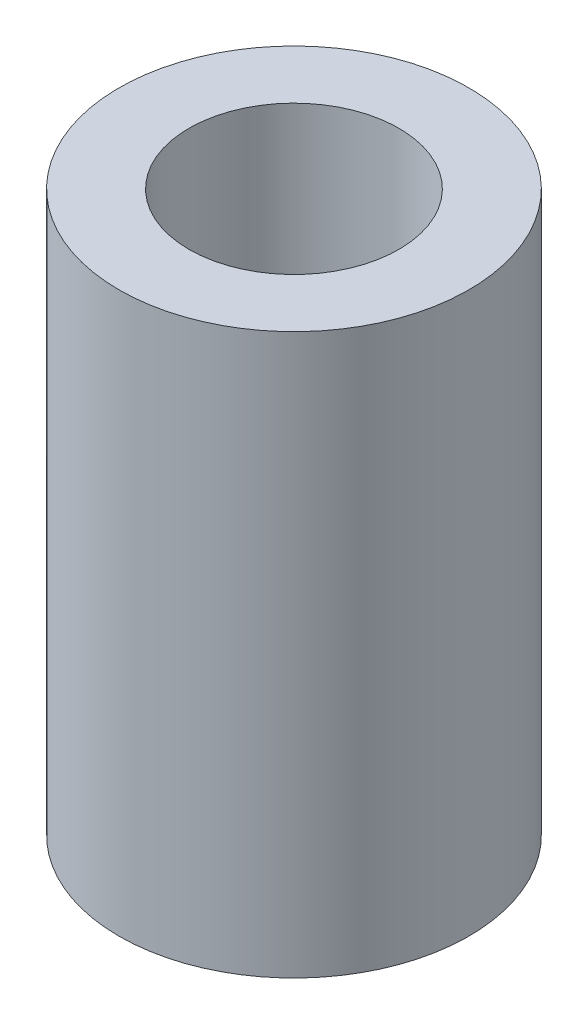
ISO-10303-21;
HEADER;
FILE_DESCRIPTION(('STEP AP214'),'2;1');
FILE_NAME('part.step','',(''),(''),'','','');
FILE_SCHEMA(('AUTOMOTIVE_DESIGN { 1 0 10303 214 1 1 1 1 }'));
ENDSEC;
DATA;
#1=APPLICATION_CONTEXT('core data for automotive mechanical design processes');
#2=APPLICATION_PROTOCOL_DEFINITION('international standard','automotive_design',2000,#1);
#3=PRODUCT_CONTEXT('',#1,'mechanical');
#4=PRODUCT('Part','Part','',(#3));
#5=PRODUCT_RELATED_PRODUCT_CATEGORY('part','',(#4));
#6=PRODUCT_DEFINITION_FORMATION('','',#4);
#7=PRODUCT_DEFINITION_CONTEXT('part definition',#1,'design');
#8=PRODUCT_DEFINITION('design','',#6,#7);
#9=PRODUCT_DEFINITION_SHAPE('','',#8);
#10=(LENGTH_UNIT() NAMED_UNIT(*) SI_UNIT(.MILLI.,.METRE.));
#11=(NAMED_UNIT(*) PLANE_ANGLE_UNIT() SI_UNIT($,.RADIAN.));
#12=(NAMED_UNIT(*) SI_UNIT($,.STERADIAN.) SOLID_ANGLE_UNIT());
#13=UNCERTAINTY_MEASURE_WITH_UNIT(LENGTH_MEASURE(1.E-05),#10,'distance_accuracy_value','');
#14=(GEOMETRIC_REPRESENTATION_CONTEXT(3) GLOBAL_UNCERTAINTY_ASSIGNED_CONTEXT((#13)) GLOBAL_UNIT_ASSIGNED_CONTEXT((#10,
#11,#12)) REPRESENTATION_CONTEXT('',''));
#15=CARTESIAN_POINT('',(0.,0.,0.));
#16=DIRECTION('',(0.,0.,1.));
#17=DIRECTION('',(1.,0.,0.));
#18=AXIS2_PLACEMENT_3D('',#15,#16,#17);
#19=CARTESIAN_POINT('',(0.,4.,0.));
#20=DIRECTION('',(0.,1.,0.));
#21=DIRECTION('',(0.,0.,1.));
#22=AXIS2_PLACEMENT_3D('',#19,#20,#21);
#23=PLANE('',#22);
#24=CARTESIAN_POINT('',(0.,4.,0.));
#25=DIRECTION('',(0.,1.,0.));
#26=DIRECTION('',(0.,0.,1.));
#27=AXIS2_PLACEMENT_3D('',#24,#25,#26);
#28=CIRCLE('',#27,2.5);
#29=CARTESIAN_POINT('',(0.,4.,2.5));
#30=VERTEX_POINT('',#29);
#31=EDGE_CURVE('E10',#30,#30,#28,.T.);
#32=ORIENTED_EDGE('',*,*,#31,.T.);
#33=EDGE_LOOP('',(#32));
#34=FACE_BOUND('',#33,.T.);
#35=CARTESIAN_POINT('',(0.,4.,0.));
#36=DIRECTION('',(0.,1.,0.));
#37=DIRECTION('',(0.,0.,1.));
#38=AXIS2_PLACEMENT_3D('',#35,#36,#37);
#39=CIRCLE('',#38,1.5);
#40=CARTESIAN_POINT('',(0.,4.,1.5));
#41=VERTEX_POINT('',#40);
#42=EDGE_CURVE('E56',#41,#41,#39,.T.);
#43=ORIENTED_EDGE('',*,*,#42,.F.);
#44=EDGE_LOOP('',(#43));
#45=FACE_BOUND('',#44,.T.);
#46=ADVANCED_FACE('F43',(#34,#45),#23,.T.);
#47=CARTESIAN_POINT('',(0.,-4.,0.));
#48=DIRECTION('',(0.,1.,0.));
#49=DIRECTION('',(0.,0.,1.));
#50=AXIS2_PLACEMENT_3D('',#47,#48,#49);
#51=PLANE('',#50);
#52=CARTESIAN_POINT('',(0.,-4.,0.));
#53=DIRECTION('',(0.,1.,0.));
#54=DIRECTION('',(0.,0.,1.));
#55=AXIS2_PLACEMENT_3D('',#52,#53,#54);
#56=CIRCLE('',#55,2.5);
#57=CARTESIAN_POINT('',(0.,-4.,2.5));
#58=VERTEX_POINT('',#57);
#59=EDGE_CURVE('E47',#58,#58,#56,.T.);
#60=ORIENTED_EDGE('',*,*,#59,.F.);
#61=EDGE_LOOP('',(#60));
#62=FACE_BOUND('',#61,.T.);
#63=CARTESIAN_POINT('',(0.,-4.,0.));
#64=DIRECTION('',(0.,1.,0.));
#65=DIRECTION('',(0.,0.,1.));
#66=AXIS2_PLACEMENT_3D('',#63,#64,#65);
#67=CIRCLE('',#66,1.5);
#68=CARTESIAN_POINT('',(0.,-4.,1.5));
#69=VERTEX_POINT('',#68);
#70=EDGE_CURVE('E58',#69,#69,#67,.T.);
#71=ORIENTED_EDGE('',*,*,#70,.T.);
#72=EDGE_LOOP('',(#71));
#73=FACE_BOUND('',#72,.T.);
#74=ADVANCED_FACE('F70',(#62,#73),#51,.F.);
#75=CARTESIAN_POINT('',(0.,4.,0.));
#76=DIRECTION('',(0.,-1.,0.));
#77=DIRECTION('',(0.,0.,-1.));
#78=AXIS2_PLACEMENT_3D('',#75,#76,#77);
#79=CYLINDRICAL_SURFACE('',#78,2.5);
#80=ORIENTED_EDGE('',*,*,#31,.F.);
#81=EDGE_LOOP('',(#80));
#82=FACE_BOUND('',#81,.T.);
#83=ORIENTED_EDGE('',*,*,#59,.T.);
#84=EDGE_LOOP('',(#83));
#85=FACE_BOUND('',#84,.T.);
#86=ADVANCED_FACE('F45',(#82,#85),#79,.T.);
#87=CARTESIAN_POINT('',(0.,4.,0.));
#88=DIRECTION('',(0.,-1.,0.));
#89=DIRECTION('',(0.,0.,-1.));
#90=AXIS2_PLACEMENT_3D('',#87,#88,#89);
#91=CYLINDRICAL_SURFACE('',#90,1.5);
#92=ORIENTED_EDGE('',*,*,#42,.T.);
#93=EDGE_LOOP('',(#92));
#94=FACE_BOUND('',#93,.T.);
#95=ORIENTED_EDGE('',*,*,#70,.F.);
#96=EDGE_LOOP('',(#95));
#97=FACE_BOUND('',#96,.T.);
#98=ADVANCED_FACE('F66',(#94,#97),#91,.F.);
#99=CLOSED_SHELL('',(#46,#74,#86,#98));
#100=MANIFOLD_SOLID_BREP('B2',#99);
#101=ADVANCED_BREP_SHAPE_REPRESENTATION('',(#18,#100),#14);
#102=SHAPE_DEFINITION_REPRESENTATION(#9,#101);
ENDSEC;
END-ISO-10303-21;
